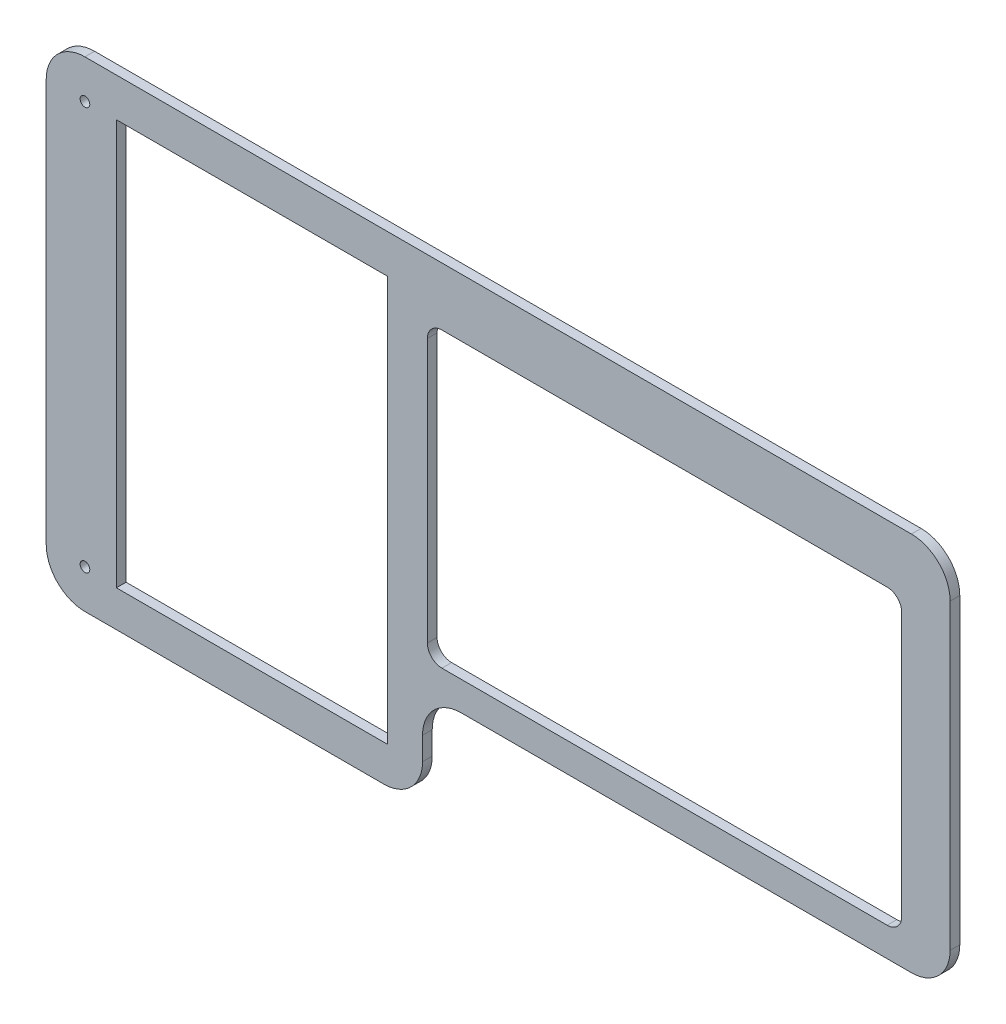
ISO-10303-21;
HEADER;
FILE_DESCRIPTION(('STEP AP214'),'2;1');
FILE_NAME('part.step','',(''),(''),'','','');
FILE_SCHEMA(('AUTOMOTIVE_DESIGN { 1 0 10303 214 1 1 1 1 }'));
ENDSEC;
DATA;
#1=APPLICATION_CONTEXT('core data for automotive mechanical design processes');
#2=APPLICATION_PROTOCOL_DEFINITION('international standard','automotive_design',2000,#1);
#3=PRODUCT_CONTEXT('',#1,'mechanical');
#4=PRODUCT('Part','Part','',(#3));
#5=PRODUCT_RELATED_PRODUCT_CATEGORY('part','',(#4));
#6=PRODUCT_DEFINITION_FORMATION('','',#4);
#7=PRODUCT_DEFINITION_CONTEXT('part definition',#1,'design');
#8=PRODUCT_DEFINITION('design','',#6,#7);
#9=PRODUCT_DEFINITION_SHAPE('','',#8);
#10=(LENGTH_UNIT() NAMED_UNIT(*) SI_UNIT(.MILLI.,.METRE.));
#11=(NAMED_UNIT(*) PLANE_ANGLE_UNIT() SI_UNIT($,.RADIAN.));
#12=(NAMED_UNIT(*) SI_UNIT($,.STERADIAN.) SOLID_ANGLE_UNIT());
#13=UNCERTAINTY_MEASURE_WITH_UNIT(LENGTH_MEASURE(1.E-05),#10,'distance_accuracy_value','');
#14=(GEOMETRIC_REPRESENTATION_CONTEXT(3) GLOBAL_UNCERTAINTY_ASSIGNED_CONTEXT((#13)) GLOBAL_UNIT_ASSIGNED_CONTEXT((#10,
#11,#12)) REPRESENTATION_CONTEXT('',''));
#15=CARTESIAN_POINT('',(0.,0.,0.));
#16=DIRECTION('',(0.,0.,1.));
#17=DIRECTION('',(1.,0.,0.));
#18=AXIS2_PLACEMENT_3D('',#15,#16,#17);
#19=CARTESIAN_POINT('',(51.,-31.,2.));
#20=DIRECTION('',(0.,0.,-1.));
#21=DIRECTION('',(-1.,0.,0.));
#22=AXIS2_PLACEMENT_3D('',#19,#20,#21);
#23=CYLINDRICAL_SURFACE('',#22,8.);
#24=CARTESIAN_POINT('',(51.,-31.,0.));
#25=DIRECTION('',(0.,0.,1.));
#26=DIRECTION('',(1.,0.,0.));
#27=AXIS2_PLACEMENT_3D('',#24,#25,#26);
#28=CIRCLE('',#27,8.);
#29=CARTESIAN_POINT('',(51.,-39.,0.));
#30=VERTEX_POINT('',#29);
#31=CARTESIAN_POINT('',(59.,-30.9999999999999,0.));
#32=VERTEX_POINT('',#31);
#33=EDGE_CURVE('E314',#30,#32,#28,.T.);
#34=ORIENTED_EDGE('',*,*,#33,.T.);
#35=DIRECTION('',(0.,0.,-1.));
#36=VECTOR('',#35,1.);
#37=CARTESIAN_POINT('',(59.,-30.9999999999999,2.));
#38=LINE('',#37,#36);
#39=CARTESIAN_POINT('',(59.,-30.9999999999999,2.));
#40=VERTEX_POINT('',#39);
#41=EDGE_CURVE('E11',#40,#32,#38,.T.);
#42=ORIENTED_EDGE('',*,*,#41,.F.);
#43=CARTESIAN_POINT('',(51.,-31.,2.));
#44=DIRECTION('',(0.,0.,1.));
#45=DIRECTION('',(1.,0.,0.));
#46=AXIS2_PLACEMENT_3D('',#43,#44,#45);
#47=CIRCLE('',#46,8.);
#48=CARTESIAN_POINT('',(51.,-39.,2.));
#49=VERTEX_POINT('',#48);
#50=EDGE_CURVE('E315',#49,#40,#47,.T.);
#51=ORIENTED_EDGE('',*,*,#50,.F.);
#52=DIRECTION('',(0.,0.,-1.));
#53=VECTOR('',#52,1.);
#54=CARTESIAN_POINT('',(51.,-39.,2.));
#55=LINE('',#54,#53);
#56=EDGE_CURVE('E353',#49,#30,#55,.T.);
#57=ORIENTED_EDGE('',*,*,#56,.T.);
#58=EDGE_LOOP('',(#34,#42,#51,#57));
#59=FACE_BOUND('',#58,.T.);
#60=ADVANCED_FACE('F39',(#59),#23,.T.);
#61=CARTESIAN_POINT('',(59.,31.5,2.));
#62=DIRECTION('',(-1.,0.,0.));
#63=DIRECTION('',(0.,-1.,0.));
#64=AXIS2_PLACEMENT_3D('',#61,#62,#63);
#65=PLANE('',#64);
#66=DIRECTION('',(0.,1.,0.));
#67=VECTOR('',#66,1.);
#68=CARTESIAN_POINT('',(59.,31.5,0.));
#69=LINE('',#68,#67);
#70=CARTESIAN_POINT('',(59.,31.5,0.));
#71=VERTEX_POINT('',#70);
#72=EDGE_CURVE('E357',#32,#71,#69,.T.);
#73=ORIENTED_EDGE('',*,*,#72,.T.);
#74=DIRECTION('',(0.,0.,-1.));
#75=VECTOR('',#74,1.);
#76=CARTESIAN_POINT('',(59.,31.5,2.));
#77=LINE('',#76,#75);
#78=CARTESIAN_POINT('',(59.,31.5,2.));
#79=VERTEX_POINT('',#78);
#80=EDGE_CURVE('E49',#79,#71,#77,.T.);
#81=ORIENTED_EDGE('',*,*,#80,.F.);
#82=DIRECTION('',(0.,1.,0.));
#83=VECTOR('',#82,1.);
#84=CARTESIAN_POINT('',(59.,31.5,2.));
#85=LINE('',#84,#83);
#86=EDGE_CURVE('E319',#40,#79,#85,.T.);
#87=ORIENTED_EDGE('',*,*,#86,.F.);
#88=ORIENTED_EDGE('',*,*,#41,.T.);
#89=EDGE_LOOP('',(#73,#81,#87,#88));
#90=FACE_BOUND('',#89,.T.);
#91=ADVANCED_FACE('F517',(#90),#65,.F.);
#92=CARTESIAN_POINT('',(51.,31.5,2.));
#93=DIRECTION('',(0.,0.,-1.));
#94=DIRECTION('',(-1.,0.,0.));
#95=AXIS2_PLACEMENT_3D('',#92,#93,#94);
#96=CYLINDRICAL_SURFACE('',#95,7.99999999999999);
#97=CARTESIAN_POINT('',(51.,31.5,0.));
#98=DIRECTION('',(0.,0.,1.));
#99=DIRECTION('',(-1.,0.,0.));
#100=AXIS2_PLACEMENT_3D('',#97,#98,#99);
#101=CIRCLE('',#100,7.99999999999999);
#102=CARTESIAN_POINT('',(51.,39.5,0.));
#103=VERTEX_POINT('',#102);
#104=EDGE_CURVE('E360',#71,#103,#101,.T.);
#105=ORIENTED_EDGE('',*,*,#104,.T.);
#106=DIRECTION('',(0.,0.,-1.));
#107=VECTOR('',#106,1.);
#108=CARTESIAN_POINT('',(51.,39.5,2.));
#109=LINE('',#108,#107);
#110=CARTESIAN_POINT('',(51.,39.5,2.));
#111=VERTEX_POINT('',#110);
#112=EDGE_CURVE('E424',#111,#103,#109,.T.);
#113=ORIENTED_EDGE('',*,*,#112,.F.);
#114=CARTESIAN_POINT('',(51.,31.5,2.));
#115=DIRECTION('',(0.,0.,1.));
#116=DIRECTION('',(-1.,0.,0.));
#117=AXIS2_PLACEMENT_3D('',#114,#115,#116);
#118=CIRCLE('',#117,7.99999999999999);
#119=EDGE_CURVE('E323',#79,#111,#118,.T.);
#120=ORIENTED_EDGE('',*,*,#119,.F.);
#121=ORIENTED_EDGE('',*,*,#80,.T.);
#122=EDGE_LOOP('',(#105,#113,#120,#121));
#123=FACE_BOUND('',#122,.T.);
#124=ADVANCED_FACE('F522',(#123),#96,.T.);
#125=CARTESIAN_POINT('',(-119.75,39.5,2.));
#126=DIRECTION('',(0.,-1.,0.));
#127=DIRECTION('',(1.,0.,0.));
#128=AXIS2_PLACEMENT_3D('',#125,#126,#127);
#129=PLANE('',#128);
#130=DIRECTION('',(-1.,0.,0.));
#131=VECTOR('',#130,1.);
#132=CARTESIAN_POINT('',(-119.75,39.5,0.));
#133=LINE('',#132,#131);
#134=CARTESIAN_POINT('',(-119.75,39.5,0.));
#135=VERTEX_POINT('',#134);
#136=EDGE_CURVE('E363',#103,#135,#133,.T.);
#137=ORIENTED_EDGE('',*,*,#136,.T.);
#138=DIRECTION('',(0.,0.,-1.));
#139=VECTOR('',#138,1.);
#140=CARTESIAN_POINT('',(-119.75,39.5,2.));
#141=LINE('',#140,#139);
#142=CARTESIAN_POINT('',(-119.75,39.5,2.));
#143=VERTEX_POINT('',#142);
#144=EDGE_CURVE('E420',#143,#135,#141,.T.);
#145=ORIENTED_EDGE('',*,*,#144,.F.);
#146=DIRECTION('',(-1.,0.,0.));
#147=VECTOR('',#146,1.);
#148=CARTESIAN_POINT('',(-119.75,39.5,2.));
#149=LINE('',#148,#147);
#150=EDGE_CURVE('E326',#111,#143,#149,.T.);
#151=ORIENTED_EDGE('',*,*,#150,.F.);
#152=ORIENTED_EDGE('',*,*,#112,.T.);
#153=EDGE_LOOP('',(#137,#145,#151,#152));
#154=FACE_BOUND('',#153,.T.);
#155=ADVANCED_FACE('F575',(#154),#129,.F.);
#156=CARTESIAN_POINT('',(-119.75,31.5,2.));
#157=DIRECTION('',(0.,0.,-1.));
#158=DIRECTION('',(-1.,0.,0.));
#159=AXIS2_PLACEMENT_3D('',#156,#157,#158);
#160=CYLINDRICAL_SURFACE('',#159,8.);
#161=CARTESIAN_POINT('',(-119.75,31.5,0.));
#162=DIRECTION('',(0.,0.,1.));
#163=DIRECTION('',(1.,0.,0.));
#164=AXIS2_PLACEMENT_3D('',#161,#162,#163);
#165=CIRCLE('',#164,8.);
#166=CARTESIAN_POINT('',(-127.75,31.5,0.));
#167=VERTEX_POINT('',#166);
#168=EDGE_CURVE('E366',#135,#167,#165,.T.);
#169=ORIENTED_EDGE('',*,*,#168,.T.);
#170=DIRECTION('',(0.,0.,-1.));
#171=VECTOR('',#170,1.);
#172=CARTESIAN_POINT('',(-127.75,31.5,2.));
#173=LINE('',#172,#171);
#174=CARTESIAN_POINT('',(-127.75,31.5,2.));
#175=VERTEX_POINT('',#174);
#176=EDGE_CURVE('E416',#175,#167,#173,.T.);
#177=ORIENTED_EDGE('',*,*,#176,.F.);
#178=CARTESIAN_POINT('',(-119.75,31.5,2.));
#179=DIRECTION('',(0.,0.,1.));
#180=DIRECTION('',(1.,0.,0.));
#181=AXIS2_PLACEMENT_3D('',#178,#179,#180);
#182=CIRCLE('',#181,8.);
#183=EDGE_CURVE('E329',#143,#175,#182,.T.);
#184=ORIENTED_EDGE('',*,*,#183,.F.);
#185=ORIENTED_EDGE('',*,*,#144,.T.);
#186=EDGE_LOOP('',(#169,#177,#184,#185));
#187=FACE_BOUND('',#186,.T.);
#188=ADVANCED_FACE('F572',(#187),#160,.T.);
#189=CARTESIAN_POINT('',(-127.75,31.5,2.));
#190=DIRECTION('',(1.,0.,0.));
#191=DIRECTION('',(0.,0.,-1.));
#192=AXIS2_PLACEMENT_3D('',#189,#190,#191);
#193=PLANE('',#192);
#194=DIRECTION('',(0.,-1.,0.));
#195=VECTOR('',#194,1.);
#196=CARTESIAN_POINT('',(-127.75,31.5,0.));
#197=LINE('',#196,#195);
#198=CARTESIAN_POINT('',(-127.75,-51.75,0.));
#199=VERTEX_POINT('',#198);
#200=EDGE_CURVE('E369',#167,#199,#197,.T.);
#201=ORIENTED_EDGE('',*,*,#200,.T.);
#202=DIRECTION('',(0.,0.,-1.));
#203=VECTOR('',#202,1.);
#204=CARTESIAN_POINT('',(-127.75,-51.75,2.));
#205=LINE('',#204,#203);
#206=CARTESIAN_POINT('',(-127.75,-51.75,2.));
#207=VERTEX_POINT('',#206);
#208=EDGE_CURVE('E412',#207,#199,#205,.T.);
#209=ORIENTED_EDGE('',*,*,#208,.F.);
#210=DIRECTION('',(0.,-1.,0.));
#211=VECTOR('',#210,1.);
#212=CARTESIAN_POINT('',(-127.75,31.5,2.));
#213=LINE('',#212,#211);
#214=EDGE_CURVE('E332',#175,#207,#213,.T.);
#215=ORIENTED_EDGE('',*,*,#214,.F.);
#216=ORIENTED_EDGE('',*,*,#176,.T.);
#217=EDGE_LOOP('',(#201,#209,#215,#216));
#218=FACE_BOUND('',#217,.T.);
#219=ADVANCED_FACE('F568',(#218),#193,.F.);
#220=CARTESIAN_POINT('',(-119.75,-51.75,2.));
#221=DIRECTION('',(0.,0.,-1.));
#222=DIRECTION('',(-1.,0.,0.));
#223=AXIS2_PLACEMENT_3D('',#220,#221,#222);
#224=CYLINDRICAL_SURFACE('',#223,8.00000000000001);
#225=CARTESIAN_POINT('',(-119.75,-51.75,0.));
#226=DIRECTION('',(0.,0.,1.));
#227=DIRECTION('',(1.,0.,0.));
#228=AXIS2_PLACEMENT_3D('',#225,#226,#227);
#229=CIRCLE('',#228,8.00000000000001);
#230=CARTESIAN_POINT('',(-119.75,-59.75,0.));
#231=VERTEX_POINT('',#230);
#232=EDGE_CURVE('E372',#199,#231,#229,.T.);
#233=ORIENTED_EDGE('',*,*,#232,.T.);
#234=DIRECTION('',(0.,0.,-1.));
#235=VECTOR('',#234,1.);
#236=CARTESIAN_POINT('',(-119.75,-59.75,2.));
#237=LINE('',#236,#235);
#238=CARTESIAN_POINT('',(-119.75,-59.75,2.));
#239=VERTEX_POINT('',#238);
#240=EDGE_CURVE('E408',#239,#231,#237,.T.);
#241=ORIENTED_EDGE('',*,*,#240,.F.);
#242=CARTESIAN_POINT('',(-119.75,-51.75,2.));
#243=DIRECTION('',(0.,0.,1.));
#244=DIRECTION('',(1.,0.,0.));
#245=AXIS2_PLACEMENT_3D('',#242,#243,#244);
#246=CIRCLE('',#245,8.00000000000001);
#247=EDGE_CURVE('E335',#207,#239,#246,.T.);
#248=ORIENTED_EDGE('',*,*,#247,.F.);
#249=ORIENTED_EDGE('',*,*,#208,.T.);
#250=EDGE_LOOP('',(#233,#241,#248,#249));
#251=FACE_BOUND('',#250,.T.);
#252=ADVANCED_FACE('F563',(#251),#224,.T.);
#253=CARTESIAN_POINT('',(-119.75,-59.75,2.));
#254=DIRECTION('',(0.,1.,0.));
#255=DIRECTION('',(0.,0.,1.));
#256=AXIS2_PLACEMENT_3D('',#253,#254,#255);
#257=PLANE('',#256);
#258=DIRECTION('',(1.,0.,0.));
#259=VECTOR('',#258,1.);
#260=CARTESIAN_POINT('',(-119.75,-59.75,0.));
#261=LINE('',#260,#259);
#262=CARTESIAN_POINT('',(-58.,-59.75,0.));
#263=VERTEX_POINT('',#262);
#264=EDGE_CURVE('E375',#231,#263,#261,.T.);
#265=ORIENTED_EDGE('',*,*,#264,.T.);
#266=DIRECTION('',(0.,0.,-1.));
#267=VECTOR('',#266,1.);
#268=CARTESIAN_POINT('',(-58.,-59.75,2.));
#269=LINE('',#268,#267);
#270=CARTESIAN_POINT('',(-58.,-59.75,2.));
#271=VERTEX_POINT('',#270);
#272=EDGE_CURVE('E404',#271,#263,#269,.T.);
#273=ORIENTED_EDGE('',*,*,#272,.F.);
#274=DIRECTION('',(1.,0.,0.));
#275=VECTOR('',#274,1.);
#276=CARTESIAN_POINT('',(-119.75,-59.75,2.));
#277=LINE('',#276,#275);
#278=EDGE_CURVE('E338',#239,#271,#277,.T.);
#279=ORIENTED_EDGE('',*,*,#278,.F.);
#280=ORIENTED_EDGE('',*,*,#240,.T.);
#281=EDGE_LOOP('',(#265,#273,#279,#280));
#282=FACE_BOUND('',#281,.T.);
#283=ADVANCED_FACE('F557',(#282),#257,.F.);
#284=CARTESIAN_POINT('',(-58.,-51.75,2.));
#285=DIRECTION('',(0.,0.,-1.));
#286=DIRECTION('',(-1.,0.,0.));
#287=AXIS2_PLACEMENT_3D('',#284,#285,#286);
#288=CYLINDRICAL_SURFACE('',#287,8.);
#289=CARTESIAN_POINT('',(-58.,-51.75,0.));
#290=DIRECTION('',(0.,0.,1.));
#291=DIRECTION('',(-1.,0.,0.));
#292=AXIS2_PLACEMENT_3D('',#289,#290,#291);
#293=CIRCLE('',#292,8.);
#294=CARTESIAN_POINT('',(-50.,-51.75,0.));
#295=VERTEX_POINT('',#294);
#296=EDGE_CURVE('E378',#263,#295,#293,.T.);
#297=ORIENTED_EDGE('',*,*,#296,.T.);
#298=DIRECTION('',(0.,0.,-1.));
#299=VECTOR('',#298,1.);
#300=CARTESIAN_POINT('',(-50.,-51.75,2.));
#301=LINE('',#300,#299);
#302=CARTESIAN_POINT('',(-50.,-51.75,2.));
#303=VERTEX_POINT('',#302);
#304=EDGE_CURVE('E400',#303,#295,#301,.T.);
#305=ORIENTED_EDGE('',*,*,#304,.F.);
#306=CARTESIAN_POINT('',(-58.,-51.75,2.));
#307=DIRECTION('',(0.,0.,1.));
#308=DIRECTION('',(-1.,0.,0.));
#309=AXIS2_PLACEMENT_3D('',#306,#307,#308);
#310=CIRCLE('',#309,8.);
#311=EDGE_CURVE('E341',#271,#303,#310,.T.);
#312=ORIENTED_EDGE('',*,*,#311,.F.);
#313=ORIENTED_EDGE('',*,*,#272,.T.);
#314=EDGE_LOOP('',(#297,#305,#312,#313));
#315=FACE_BOUND('',#314,.T.);
#316=ADVANCED_FACE('F553',(#315),#288,.T.);
#317=CARTESIAN_POINT('',(-50.,-51.75,2.));
#318=DIRECTION('',(-1.,0.,0.));
#319=DIRECTION('',(0.,0.,1.));
#320=AXIS2_PLACEMENT_3D('',#317,#318,#319);
#321=PLANE('',#320);
#322=DIRECTION('',(0.,1.,0.));
#323=VECTOR('',#322,1.);
#324=CARTESIAN_POINT('',(-50.,-51.75,0.));
#325=LINE('',#324,#323);
#326=CARTESIAN_POINT('',(-50.,-47.0000000000001,0.));
#327=VERTEX_POINT('',#326);
#328=EDGE_CURVE('E381',#295,#327,#325,.T.);
#329=ORIENTED_EDGE('',*,*,#328,.T.);
#330=DIRECTION('',(0.,0.,-1.));
#331=VECTOR('',#330,1.);
#332=CARTESIAN_POINT('',(-50.,-47.0000000000001,2.));
#333=LINE('',#332,#331);
#334=CARTESIAN_POINT('',(-50.,-47.0000000000001,2.));
#335=VERTEX_POINT('',#334);
#336=EDGE_CURVE('E396',#335,#327,#333,.T.);
#337=ORIENTED_EDGE('',*,*,#336,.F.);
#338=DIRECTION('',(0.,1.,0.));
#339=VECTOR('',#338,1.);
#340=CARTESIAN_POINT('',(-50.,-51.75,2.));
#341=LINE('',#340,#339);
#342=EDGE_CURVE('E344',#303,#335,#341,.T.);
#343=ORIENTED_EDGE('',*,*,#342,.F.);
#344=ORIENTED_EDGE('',*,*,#304,.T.);
#345=EDGE_LOOP('',(#329,#337,#343,#344));
#346=FACE_BOUND('',#345,.T.);
#347=ADVANCED_FACE('F548',(#346),#321,.F.);
#348=CARTESIAN_POINT('',(-42.,-47.,2.));
#349=DIRECTION('',(0.,0.,-1.));
#350=DIRECTION('',(-1.,0.,0.));
#351=AXIS2_PLACEMENT_3D('',#348,#349,#350);
#352=CYLINDRICAL_SURFACE('',#351,8.);
#353=CARTESIAN_POINT('',(-42.,-47.,0.));
#354=DIRECTION('',(0.,0.,-1.));
#355=DIRECTION('',(-1.,0.,0.));
#356=AXIS2_PLACEMENT_3D('',#353,#354,#355);
#357=CIRCLE('',#356,8.);
#358=CARTESIAN_POINT('',(-41.9999999999999,-39.,0.));
#359=VERTEX_POINT('',#358);
#360=EDGE_CURVE('E384',#327,#359,#357,.T.);
#361=ORIENTED_EDGE('',*,*,#360,.T.);
#362=DIRECTION('',(0.,0.,-1.));
#363=VECTOR('',#362,1.);
#364=CARTESIAN_POINT('',(-41.9999999999999,-39.,2.));
#365=LINE('',#364,#363);
#366=CARTESIAN_POINT('',(-41.9999999999999,-39.,2.));
#367=VERTEX_POINT('',#366);
#368=EDGE_CURVE('E392',#367,#359,#365,.T.);
#369=ORIENTED_EDGE('',*,*,#368,.F.);
#370=CARTESIAN_POINT('',(-42.,-47.,2.));
#371=DIRECTION('',(0.,0.,-1.));
#372=DIRECTION('',(-1.,0.,0.));
#373=AXIS2_PLACEMENT_3D('',#370,#371,#372);
#374=CIRCLE('',#373,8.);
#375=EDGE_CURVE('E347',#335,#367,#374,.T.);
#376=ORIENTED_EDGE('',*,*,#375,.F.);
#377=ORIENTED_EDGE('',*,*,#336,.T.);
#378=EDGE_LOOP('',(#361,#369,#376,#377));
#379=FACE_BOUND('',#378,.T.);
#380=ADVANCED_FACE('F542',(#379),#352,.F.);
#381=CARTESIAN_POINT('',(-41.9999999999999,-39.,2.));
#382=DIRECTION('',(0.,1.,0.));
#383=DIRECTION('',(0.,0.,1.));
#384=AXIS2_PLACEMENT_3D('',#381,#382,#383);
#385=PLANE('',#384);
#386=DIRECTION('',(1.,0.,0.));
#387=VECTOR('',#386,1.);
#388=CARTESIAN_POINT('',(-41.9999999999999,-39.,0.));
#389=LINE('',#388,#387);
#390=EDGE_CURVE('E320',#359,#30,#389,.T.);
#391=ORIENTED_EDGE('',*,*,#390,.T.);
#392=ORIENTED_EDGE('',*,*,#56,.F.);
#393=DIRECTION('',(1.,0.,0.));
#394=VECTOR('',#393,1.);
#395=CARTESIAN_POINT('',(-41.9999999999999,-39.,2.));
#396=LINE('',#395,#394);
#397=EDGE_CURVE('E350',#367,#49,#396,.T.);
#398=ORIENTED_EDGE('',*,*,#397,.F.);
#399=ORIENTED_EDGE('',*,*,#368,.T.);
#400=EDGE_LOOP('',(#391,#392,#398,#399));
#401=FACE_BOUND('',#400,.T.);
#402=ADVANCED_FACE('F540',(#401),#385,.F.);
#403=CARTESIAN_POINT('',(51.,-31.,2.));
#404=DIRECTION('',(0.,0.,1.));
#405=DIRECTION('',(1.,0.,0.));
#406=AXIS2_PLACEMENT_3D('',#403,#404,#405);
#407=PLANE('',#406);
#408=DIRECTION('',(0.,-1.,0.));
#409=VECTOR('',#408,1.);
#410=CARTESIAN_POINT('',(-113.25,-31.,2.));
#411=LINE('',#410,#409);
#412=CARTESIAN_POINT('',(-113.25,31.5,2.));
#413=VERTEX_POINT('',#412);
#414=CARTESIAN_POINT('',(-113.25,-52.25,2.));
#415=VERTEX_POINT('',#414);
#416=EDGE_CURVE('E295',#413,#415,#411,.T.);
#417=ORIENTED_EDGE('',*,*,#416,.F.);
#418=DIRECTION('',(-1.,0.,0.));
#419=VECTOR('',#418,1.);
#420=CARTESIAN_POINT('',(51.,31.5,2.));
#421=LINE('',#420,#419);
#422=CARTESIAN_POINT('',(-57.25,31.5,2.));
#423=VERTEX_POINT('',#422);
#424=EDGE_CURVE('E292',#423,#413,#421,.T.);
#425=ORIENTED_EDGE('',*,*,#424,.F.);
#426=DIRECTION('',(0.,1.,0.));
#427=VECTOR('',#426,1.);
#428=CARTESIAN_POINT('',(-57.25,-31.,2.));
#429=LINE('',#428,#427);
#430=CARTESIAN_POINT('',(-57.25,-52.25,2.));
#431=VERTEX_POINT('',#430);
#432=EDGE_CURVE('E289',#431,#423,#429,.T.);
#433=ORIENTED_EDGE('',*,*,#432,.F.);
#434=DIRECTION('',(1.,0.,0.));
#435=VECTOR('',#434,1.);
#436=CARTESIAN_POINT('',(51.,-52.25,2.));
#437=LINE('',#436,#435);
#438=EDGE_CURVE('E95',#415,#431,#437,.T.);
#439=ORIENTED_EDGE('',*,*,#438,.F.);
#440=EDGE_LOOP('',(#417,#425,#433,#439));
#441=FACE_BOUND('',#440,.T.);
#442=CARTESIAN_POINT('',(46.,24.5,2.));
#443=DIRECTION('',(0.,0.,1.));
#444=DIRECTION('',(1.,0.,0.));
#445=AXIS2_PLACEMENT_3D('',#442,#443,#444);
#446=CIRCLE('',#445,3.);
#447=CARTESIAN_POINT('',(49.,24.5,2.));
#448=VERTEX_POINT('',#447);
#449=CARTESIAN_POINT('',(46.,27.5,2.));
#450=VERTEX_POINT('',#449);
#451=EDGE_CURVE('E42',#448,#450,#446,.T.);
#452=ORIENTED_EDGE('',*,*,#451,.F.);
#453=DIRECTION('',(0.,1.,0.));
#454=VECTOR('',#453,1.);
#455=CARTESIAN_POINT('',(49.,24.5,2.));
#456=LINE('',#455,#454);
#457=CARTESIAN_POINT('',(49.,-30.,2.));
#458=VERTEX_POINT('',#457);
#459=EDGE_CURVE('E89',#458,#448,#456,.T.);
#460=ORIENTED_EDGE('',*,*,#459,.F.);
#461=CARTESIAN_POINT('',(46.,-30.,2.));
#462=DIRECTION('',(0.,0.,1.));
#463=DIRECTION('',(1.,0.,0.));
#464=AXIS2_PLACEMENT_3D('',#461,#462,#463);
#465=CIRCLE('',#464,3.);
#466=CARTESIAN_POINT('',(46.,-33.,2.));
#467=VERTEX_POINT('',#466);
#468=EDGE_CURVE('E445',#467,#458,#465,.T.);
#469=ORIENTED_EDGE('',*,*,#468,.F.);
#470=DIRECTION('',(1.,0.,0.));
#471=VECTOR('',#470,1.);
#472=CARTESIAN_POINT('',(-46.,-33.,2.));
#473=LINE('',#472,#471);
#474=CARTESIAN_POINT('',(-46.,-33.,2.));
#475=VERTEX_POINT('',#474);
#476=EDGE_CURVE('E442',#475,#467,#473,.T.);
#477=ORIENTED_EDGE('',*,*,#476,.F.);
#478=CARTESIAN_POINT('',(-46.,-30.,2.));
#479=DIRECTION('',(0.,0.,1.));
#480=DIRECTION('',(1.,0.,0.));
#481=AXIS2_PLACEMENT_3D('',#478,#479,#480);
#482=CIRCLE('',#481,3.);
#483=CARTESIAN_POINT('',(-49.,-30.,2.));
#484=VERTEX_POINT('',#483);
#485=EDGE_CURVE('E439',#484,#475,#482,.T.);
#486=ORIENTED_EDGE('',*,*,#485,.F.);
#487=DIRECTION('',(0.,1.,0.));
#488=VECTOR('',#487,1.);
#489=CARTESIAN_POINT('',(-49.,24.5,2.));
#490=LINE('',#489,#488);
#491=CARTESIAN_POINT('',(-49.,24.5,2.));
#492=VERTEX_POINT('',#491);
#493=EDGE_CURVE('E436',#492,#484,#490,.F.);
#494=ORIENTED_EDGE('',*,*,#493,.F.);
#495=CARTESIAN_POINT('',(-46.,24.5,2.));
#496=DIRECTION('',(0.,0.,1.));
#497=DIRECTION('',(1.,0.,0.));
#498=AXIS2_PLACEMENT_3D('',#495,#496,#497);
#499=CIRCLE('',#498,3.);
#500=CARTESIAN_POINT('',(-46.,27.5,2.));
#501=VERTEX_POINT('',#500);
#502=EDGE_CURVE('E433',#501,#492,#499,.T.);
#503=ORIENTED_EDGE('',*,*,#502,.F.);
#504=DIRECTION('',(1.,0.,0.));
#505=VECTOR('',#504,1.);
#506=CARTESIAN_POINT('',(-46.,27.5,2.));
#507=LINE('',#506,#505);
#508=EDGE_CURVE('E225',#450,#501,#507,.F.);
#509=ORIENTED_EDGE('',*,*,#508,.F.);
#510=EDGE_LOOP('',(#452,#460,#469,#477,#486,#494,#503,#509));
#511=FACE_BOUND('',#510,.T.);
#512=CARTESIAN_POINT('',(-119.75,31.5,2.));
#513=DIRECTION('',(0.,0.,1.));
#514=DIRECTION('',(1.,0.,0.));
#515=AXIS2_PLACEMENT_3D('',#512,#513,#514);
#516=CIRCLE('',#515,0.999999999999998);
#517=CARTESIAN_POINT('',(-118.75,31.5,2.));
#518=VERTEX_POINT('',#517);
#519=EDGE_CURVE('E310',#518,#518,#516,.T.);
#520=ORIENTED_EDGE('',*,*,#519,.F.);
#521=EDGE_LOOP('',(#520));
#522=FACE_BOUND('',#521,.T.);
#523=CARTESIAN_POINT('',(-119.75,-51.75,2.));
#524=DIRECTION('',(0.,0.,1.));
#525=DIRECTION('',(1.,0.,0.));
#526=AXIS2_PLACEMENT_3D('',#523,#524,#525);
#527=CIRCLE('',#526,0.999999999999998);
#528=CARTESIAN_POINT('',(-118.75,-51.75,2.));
#529=VERTEX_POINT('',#528);
#530=EDGE_CURVE('E303',#529,#529,#527,.T.);
#531=ORIENTED_EDGE('',*,*,#530,.F.);
#532=EDGE_LOOP('',(#531));
#533=FACE_BOUND('',#532,.T.);
#534=ORIENTED_EDGE('',*,*,#50,.T.);
#535=ORIENTED_EDGE('',*,*,#86,.T.);
#536=ORIENTED_EDGE('',*,*,#119,.T.);
#537=ORIENTED_EDGE('',*,*,#150,.T.);
#538=ORIENTED_EDGE('',*,*,#183,.T.);
#539=ORIENTED_EDGE('',*,*,#214,.T.);
#540=ORIENTED_EDGE('',*,*,#247,.T.);
#541=ORIENTED_EDGE('',*,*,#278,.T.);
#542=ORIENTED_EDGE('',*,*,#311,.T.);
#543=ORIENTED_EDGE('',*,*,#342,.T.);
#544=ORIENTED_EDGE('',*,*,#375,.T.);
#545=ORIENTED_EDGE('',*,*,#397,.T.);
#546=EDGE_LOOP('',(#534,#535,#536,#537,#538,#539,#540,#541,#542,#543,#544,#545));
#547=FACE_BOUND('',#546,.T.);
#548=ADVANCED_FACE('F460',(#441,#511,#522,#533,#547),#407,.T.);
#549=CARTESIAN_POINT('',(51.,-31.,0.));
#550=DIRECTION('',(0.,0.,1.));
#551=DIRECTION('',(1.,0.,0.));
#552=AXIS2_PLACEMENT_3D('',#549,#550,#551);
#553=PLANE('',#552);
#554=DIRECTION('',(-1.,0.,0.));
#555=VECTOR('',#554,1.);
#556=CARTESIAN_POINT('',(-113.25,31.5,0.));
#557=LINE('',#556,#555);
#558=CARTESIAN_POINT('',(-57.25,31.5,0.));
#559=VERTEX_POINT('',#558);
#560=CARTESIAN_POINT('',(-113.25,31.5,0.));
#561=VERTEX_POINT('',#560);
#562=EDGE_CURVE('E201',#559,#561,#557,.T.);
#563=ORIENTED_EDGE('',*,*,#562,.T.);
#564=DIRECTION('',(0.,-1.,0.));
#565=VECTOR('',#564,1.);
#566=CARTESIAN_POINT('',(-113.25,31.5,0.));
#567=LINE('',#566,#565);
#568=CARTESIAN_POINT('',(-113.25,-52.25,0.));
#569=VERTEX_POINT('',#568);
#570=EDGE_CURVE('E212',#561,#569,#567,.T.);
#571=ORIENTED_EDGE('',*,*,#570,.T.);
#572=DIRECTION('',(1.,0.,0.));
#573=VECTOR('',#572,1.);
#574=CARTESIAN_POINT('',(-113.25,-52.25,0.));
#575=LINE('',#574,#573);
#576=CARTESIAN_POINT('',(-57.25,-52.25,0.));
#577=VERTEX_POINT('',#576);
#578=EDGE_CURVE('E202',#569,#577,#575,.T.);
#579=ORIENTED_EDGE('',*,*,#578,.T.);
#580=DIRECTION('',(0.,1.,0.));
#581=VECTOR('',#580,1.);
#582=CARTESIAN_POINT('',(-57.25,31.5,0.));
#583=LINE('',#582,#581);
#584=EDGE_CURVE('E189',#577,#559,#583,.T.);
#585=ORIENTED_EDGE('',*,*,#584,.T.);
#586=EDGE_LOOP('',(#563,#571,#579,#585));
#587=FACE_BOUND('',#586,.T.);
#588=DIRECTION('',(0.,1.,0.));
#589=VECTOR('',#588,1.);
#590=CARTESIAN_POINT('',(49.,24.5,0.));
#591=LINE('',#590,#589);
#592=CARTESIAN_POINT('',(49.,-30.,0.));
#593=VERTEX_POINT('',#592);
#594=CARTESIAN_POINT('',(49.,24.5,0.));
#595=VERTEX_POINT('',#594);
#596=EDGE_CURVE('E256',#593,#595,#591,.T.);
#597=ORIENTED_EDGE('',*,*,#596,.T.);
#598=CARTESIAN_POINT('',(46.,24.5,0.));
#599=DIRECTION('',(0.,0.,1.));
#600=DIRECTION('',(-1.,0.,0.));
#601=AXIS2_PLACEMENT_3D('',#598,#599,#600);
#602=CIRCLE('',#601,3.);
#603=CARTESIAN_POINT('',(46.,27.5,0.));
#604=VERTEX_POINT('',#603);
#605=EDGE_CURVE('E230',#595,#604,#602,.T.);
#606=ORIENTED_EDGE('',*,*,#605,.T.);
#607=DIRECTION('',(-1.,0.,0.));
#608=VECTOR('',#607,1.);
#609=CARTESIAN_POINT('',(-46.,27.5,0.));
#610=LINE('',#609,#608);
#611=CARTESIAN_POINT('',(-46.,27.5,0.));
#612=VERTEX_POINT('',#611);
#613=EDGE_CURVE('E234',#604,#612,#610,.T.);
#614=ORIENTED_EDGE('',*,*,#613,.T.);
#615=CARTESIAN_POINT('',(-46.,24.5,0.));
#616=DIRECTION('',(0.,0.,1.));
#617=DIRECTION('',(1.,0.,0.));
#618=AXIS2_PLACEMENT_3D('',#615,#616,#617);
#619=CIRCLE('',#618,3.);
#620=CARTESIAN_POINT('',(-49.,24.5,0.));
#621=VERTEX_POINT('',#620);
#622=EDGE_CURVE('E183',#612,#621,#619,.T.);
#623=ORIENTED_EDGE('',*,*,#622,.T.);
#624=DIRECTION('',(0.,-1.,0.));
#625=VECTOR('',#624,1.);
#626=CARTESIAN_POINT('',(-49.,24.5,0.));
#627=LINE('',#626,#625);
#628=CARTESIAN_POINT('',(-49.,-30.,0.));
#629=VERTEX_POINT('',#628);
#630=EDGE_CURVE('E240',#621,#629,#627,.T.);
#631=ORIENTED_EDGE('',*,*,#630,.T.);
#632=CARTESIAN_POINT('',(-46.,-30.,0.));
#633=DIRECTION('',(0.,0.,1.));
#634=DIRECTION('',(1.,0.,0.));
#635=AXIS2_PLACEMENT_3D('',#632,#633,#634);
#636=CIRCLE('',#635,3.);
#637=CARTESIAN_POINT('',(-46.,-33.,0.));
#638=VERTEX_POINT('',#637);
#639=EDGE_CURVE('E244',#629,#638,#636,.T.);
#640=ORIENTED_EDGE('',*,*,#639,.T.);
#641=DIRECTION('',(1.,0.,0.));
#642=VECTOR('',#641,1.);
#643=CARTESIAN_POINT('',(-46.,-33.,0.));
#644=LINE('',#643,#642);
#645=CARTESIAN_POINT('',(46.,-33.,0.));
#646=VERTEX_POINT('',#645);
#647=EDGE_CURVE('E248',#638,#646,#644,.T.);
#648=ORIENTED_EDGE('',*,*,#647,.T.);
#649=CARTESIAN_POINT('',(46.,-30.,0.));
#650=DIRECTION('',(0.,0.,1.));
#651=DIRECTION('',(1.,0.,0.));
#652=AXIS2_PLACEMENT_3D('',#649,#650,#651);
#653=CIRCLE('',#652,3.);
#654=EDGE_CURVE('E252',#646,#593,#653,.T.);
#655=ORIENTED_EDGE('',*,*,#654,.T.);
#656=EDGE_LOOP('',(#597,#606,#614,#623,#631,#640,#648,#655));
#657=FACE_BOUND('',#656,.T.);
#658=CARTESIAN_POINT('',(-119.75,31.5,0.));
#659=DIRECTION('',(0.,0.,1.));
#660=DIRECTION('',(1.,0.,0.));
#661=AXIS2_PLACEMENT_3D('',#658,#659,#660);
#662=CIRCLE('',#661,0.999999999999998);
#663=CARTESIAN_POINT('',(-118.75,31.5,0.));
#664=VERTEX_POINT('',#663);
#665=EDGE_CURVE('E299',#664,#664,#662,.T.);
#666=ORIENTED_EDGE('',*,*,#665,.T.);
#667=EDGE_LOOP('',(#666));
#668=FACE_BOUND('',#667,.T.);
#669=CARTESIAN_POINT('',(-119.75,-51.75,0.));
#670=DIRECTION('',(0.,0.,1.));
#671=DIRECTION('',(1.,0.,0.));
#672=AXIS2_PLACEMENT_3D('',#669,#670,#671);
#673=CIRCLE('',#672,0.999999999999998);
#674=CARTESIAN_POINT('',(-118.75,-51.75,0.));
#675=VERTEX_POINT('',#674);
#676=EDGE_CURVE('E298',#675,#675,#673,.T.);
#677=ORIENTED_EDGE('',*,*,#676,.T.);
#678=EDGE_LOOP('',(#677));
#679=FACE_BOUND('',#678,.T.);
#680=ORIENTED_EDGE('',*,*,#33,.F.);
#681=ORIENTED_EDGE('',*,*,#390,.F.);
#682=ORIENTED_EDGE('',*,*,#360,.F.);
#683=ORIENTED_EDGE('',*,*,#328,.F.);
#684=ORIENTED_EDGE('',*,*,#296,.F.);
#685=ORIENTED_EDGE('',*,*,#264,.F.);
#686=ORIENTED_EDGE('',*,*,#232,.F.);
#687=ORIENTED_EDGE('',*,*,#200,.F.);
#688=ORIENTED_EDGE('',*,*,#168,.F.);
#689=ORIENTED_EDGE('',*,*,#136,.F.);
#690=ORIENTED_EDGE('',*,*,#104,.F.);
#691=ORIENTED_EDGE('',*,*,#72,.F.);
#692=EDGE_LOOP('',(#680,#681,#682,#683,#684,#685,#686,#687,#688,#689,#690,#691));
#693=FACE_BOUND('',#692,.T.);
#694=ADVANCED_FACE('F209',(#587,#657,#668,#679,#693),#553,.F.);
#695=CARTESIAN_POINT('',(-119.75,-51.75,0.));
#696=DIRECTION('',(0.,0.,1.));
#697=DIRECTION('',(1.,0.,0.));
#698=AXIS2_PLACEMENT_3D('',#695,#696,#697);
#699=CYLINDRICAL_SURFACE('',#698,0.999999999999998);
#700=ORIENTED_EDGE('',*,*,#530,.T.);
#701=EDGE_LOOP('',(#700));
#702=FACE_BOUND('',#701,.T.);
#703=ORIENTED_EDGE('',*,*,#676,.F.);
#704=EDGE_LOOP('',(#703));
#705=FACE_BOUND('',#704,.T.);
#706=ADVANCED_FACE('F604',(#702,#705),#699,.F.);
#707=CARTESIAN_POINT('',(-119.75,31.5,0.));
#708=DIRECTION('',(0.,0.,1.));
#709=DIRECTION('',(1.,0.,0.));
#710=AXIS2_PLACEMENT_3D('',#707,#708,#709);
#711=CYLINDRICAL_SURFACE('',#710,0.999999999999998);
#712=ORIENTED_EDGE('',*,*,#519,.T.);
#713=EDGE_LOOP('',(#712));
#714=FACE_BOUND('',#713,.T.);
#715=ORIENTED_EDGE('',*,*,#665,.F.);
#716=EDGE_LOOP('',(#715));
#717=FACE_BOUND('',#716,.T.);
#718=ADVANCED_FACE('F610',(#714,#717),#711,.F.);
#719=CARTESIAN_POINT('',(46.,24.5,0.));
#720=DIRECTION('',(0.,0.,1.));
#721=DIRECTION('',(1.,0.,0.));
#722=AXIS2_PLACEMENT_3D('',#719,#720,#721);
#723=CYLINDRICAL_SURFACE('',#722,3.);
#724=ORIENTED_EDGE('',*,*,#451,.T.);
#725=DIRECTION('',(0.,0.,1.));
#726=VECTOR('',#725,1.);
#727=CARTESIAN_POINT('',(46.,27.5,0.));
#728=LINE('',#727,#726);
#729=EDGE_CURVE('E260',#604,#450,#728,.T.);
#730=ORIENTED_EDGE('',*,*,#729,.F.);
#731=ORIENTED_EDGE('',*,*,#605,.F.);
#732=DIRECTION('',(0.,0.,1.));
#733=VECTOR('',#732,1.);
#734=CARTESIAN_POINT('',(49.,24.5,0.));
#735=LINE('',#734,#733);
#736=EDGE_CURVE('E216',#595,#448,#735,.T.);
#737=ORIENTED_EDGE('',*,*,#736,.T.);
#738=EDGE_LOOP('',(#724,#730,#731,#737));
#739=FACE_BOUND('',#738,.T.);
#740=ADVANCED_FACE('F454',(#739),#723,.F.);
#741=CARTESIAN_POINT('',(49.,24.5,0.));
#742=DIRECTION('',(1.,0.,0.));
#743=DIRECTION('',(0.,1.,0.));
#744=AXIS2_PLACEMENT_3D('',#741,#742,#743);
#745=PLANE('',#744);
#746=ORIENTED_EDGE('',*,*,#459,.T.);
#747=ORIENTED_EDGE('',*,*,#736,.F.);
#748=ORIENTED_EDGE('',*,*,#596,.F.);
#749=DIRECTION('',(0.,0.,1.));
#750=VECTOR('',#749,1.);
#751=CARTESIAN_POINT('',(49.,-30.,0.));
#752=LINE('',#751,#750);
#753=EDGE_CURVE('E261',#593,#458,#752,.T.);
#754=ORIENTED_EDGE('',*,*,#753,.T.);
#755=EDGE_LOOP('',(#746,#747,#748,#754));
#756=FACE_BOUND('',#755,.T.);
#757=ADVANCED_FACE('F616',(#756),#745,.F.);
#758=CARTESIAN_POINT('',(46.,-30.,0.));
#759=DIRECTION('',(0.,0.,1.));
#760=DIRECTION('',(1.,0.,0.));
#761=AXIS2_PLACEMENT_3D('',#758,#759,#760);
#762=CYLINDRICAL_SURFACE('',#761,3.);
#763=ORIENTED_EDGE('',*,*,#468,.T.);
#764=ORIENTED_EDGE('',*,*,#753,.F.);
#765=ORIENTED_EDGE('',*,*,#654,.F.);
#766=DIRECTION('',(0.,0.,1.));
#767=VECTOR('',#766,1.);
#768=CARTESIAN_POINT('',(46.,-33.,0.));
#769=LINE('',#768,#767);
#770=EDGE_CURVE('E264',#646,#467,#769,.T.);
#771=ORIENTED_EDGE('',*,*,#770,.T.);
#772=EDGE_LOOP('',(#763,#764,#765,#771));
#773=FACE_BOUND('',#772,.T.);
#774=ADVANCED_FACE('F626',(#773),#762,.F.);
#775=CARTESIAN_POINT('',(-46.,-33.,0.));
#776=DIRECTION('',(0.,-1.,0.));
#777=DIRECTION('',(0.,0.,-1.));
#778=AXIS2_PLACEMENT_3D('',#775,#776,#777);
#779=PLANE('',#778);
#780=ORIENTED_EDGE('',*,*,#476,.T.);
#781=ORIENTED_EDGE('',*,*,#770,.F.);
#782=ORIENTED_EDGE('',*,*,#647,.F.);
#783=DIRECTION('',(0.,0.,1.));
#784=VECTOR('',#783,1.);
#785=CARTESIAN_POINT('',(-46.,-33.,0.));
#786=LINE('',#785,#784);
#787=EDGE_CURVE('E273',#638,#475,#786,.T.);
#788=ORIENTED_EDGE('',*,*,#787,.T.);
#789=EDGE_LOOP('',(#780,#781,#782,#788));
#790=FACE_BOUND('',#789,.T.);
#791=ADVANCED_FACE('F481',(#790),#779,.F.);
#792=CARTESIAN_POINT('',(-46.,-30.,0.));
#793=DIRECTION('',(0.,0.,1.));
#794=DIRECTION('',(1.,0.,0.));
#795=AXIS2_PLACEMENT_3D('',#792,#793,#794);
#796=CYLINDRICAL_SURFACE('',#795,3.);
#797=ORIENTED_EDGE('',*,*,#485,.T.);
#798=ORIENTED_EDGE('',*,*,#787,.F.);
#799=ORIENTED_EDGE('',*,*,#639,.F.);
#800=DIRECTION('',(0.,0.,1.));
#801=VECTOR('',#800,1.);
#802=CARTESIAN_POINT('',(-49.,-30.,0.));
#803=LINE('',#802,#801);
#804=EDGE_CURVE('E277',#629,#484,#803,.T.);
#805=ORIENTED_EDGE('',*,*,#804,.T.);
#806=EDGE_LOOP('',(#797,#798,#799,#805));
#807=FACE_BOUND('',#806,.T.);
#808=ADVANCED_FACE('F476',(#807),#796,.F.);
#809=CARTESIAN_POINT('',(-49.,24.5,0.));
#810=DIRECTION('',(-1.,0.,0.));
#811=DIRECTION('',(0.,0.,1.));
#812=AXIS2_PLACEMENT_3D('',#809,#810,#811);
#813=PLANE('',#812);
#814=ORIENTED_EDGE('',*,*,#493,.T.);
#815=ORIENTED_EDGE('',*,*,#804,.F.);
#816=ORIENTED_EDGE('',*,*,#630,.F.);
#817=DIRECTION('',(0.,0.,1.));
#818=VECTOR('',#817,1.);
#819=CARTESIAN_POINT('',(-49.,24.5,0.));
#820=LINE('',#819,#818);
#821=EDGE_CURVE('E281',#621,#492,#820,.T.);
#822=ORIENTED_EDGE('',*,*,#821,.T.);
#823=EDGE_LOOP('',(#814,#815,#816,#822));
#824=FACE_BOUND('',#823,.T.);
#825=ADVANCED_FACE('F469',(#824),#813,.F.);
#826=CARTESIAN_POINT('',(-46.,24.5,0.));
#827=DIRECTION('',(0.,0.,1.));
#828=DIRECTION('',(1.,0.,0.));
#829=AXIS2_PLACEMENT_3D('',#826,#827,#828);
#830=CYLINDRICAL_SURFACE('',#829,3.);
#831=ORIENTED_EDGE('',*,*,#502,.T.);
#832=ORIENTED_EDGE('',*,*,#821,.F.);
#833=ORIENTED_EDGE('',*,*,#622,.F.);
#834=DIRECTION('',(0.,0.,1.));
#835=VECTOR('',#834,1.);
#836=CARTESIAN_POINT('',(-46.,27.5,0.));
#837=LINE('',#836,#835);
#838=EDGE_CURVE('E269',#612,#501,#837,.T.);
#839=ORIENTED_EDGE('',*,*,#838,.T.);
#840=EDGE_LOOP('',(#831,#832,#833,#839));
#841=FACE_BOUND('',#840,.T.);
#842=ADVANCED_FACE('F465',(#841),#830,.F.);
#843=CARTESIAN_POINT('',(-46.,27.5,0.));
#844=DIRECTION('',(0.,1.,0.));
#845=DIRECTION('',(0.,0.,1.));
#846=AXIS2_PLACEMENT_3D('',#843,#844,#845);
#847=PLANE('',#846);
#848=ORIENTED_EDGE('',*,*,#508,.T.);
#849=ORIENTED_EDGE('',*,*,#838,.F.);
#850=ORIENTED_EDGE('',*,*,#613,.F.);
#851=ORIENTED_EDGE('',*,*,#729,.T.);
#852=EDGE_LOOP('',(#848,#849,#850,#851));
#853=FACE_BOUND('',#852,.T.);
#854=ADVANCED_FACE('F464',(#853),#847,.F.);
#855=CARTESIAN_POINT('',(-113.25,31.5,0.));
#856=DIRECTION('',(-1.,0.,0.));
#857=DIRECTION('',(0.,-1.,0.));
#858=AXIS2_PLACEMENT_3D('',#855,#856,#857);
#859=PLANE('',#858);
#860=ORIENTED_EDGE('',*,*,#416,.T.);
#861=DIRECTION('',(0.,0.,1.));
#862=VECTOR('',#861,1.);
#863=CARTESIAN_POINT('',(-113.25,-52.25,0.));
#864=LINE('',#863,#862);
#865=EDGE_CURVE('E57',#569,#415,#864,.T.);
#866=ORIENTED_EDGE('',*,*,#865,.F.);
#867=ORIENTED_EDGE('',*,*,#570,.F.);
#868=DIRECTION('',(0.,0.,1.));
#869=VECTOR('',#868,1.);
#870=CARTESIAN_POINT('',(-113.25,31.5,0.));
#871=LINE('',#870,#869);
#872=EDGE_CURVE('E221',#561,#413,#871,.T.);
#873=ORIENTED_EDGE('',*,*,#872,.T.);
#874=EDGE_LOOP('',(#860,#866,#867,#873));
#875=FACE_BOUND('',#874,.T.);
#876=ADVANCED_FACE('F505',(#875),#859,.F.);
#877=CARTESIAN_POINT('',(-113.25,31.5,0.));
#878=DIRECTION('',(0.,1.,0.));
#879=DIRECTION('',(0.,0.,1.));
#880=AXIS2_PLACEMENT_3D('',#877,#878,#879);
#881=PLANE('',#880);
#882=ORIENTED_EDGE('',*,*,#424,.T.);
#883=ORIENTED_EDGE('',*,*,#872,.F.);
#884=ORIENTED_EDGE('',*,*,#562,.F.);
#885=DIRECTION('',(0.,0.,1.));
#886=VECTOR('',#885,1.);
#887=CARTESIAN_POINT('',(-57.25,31.5,0.));
#888=LINE('',#887,#886);
#889=EDGE_CURVE('E195',#559,#423,#888,.T.);
#890=ORIENTED_EDGE('',*,*,#889,.T.);
#891=EDGE_LOOP('',(#882,#883,#884,#890));
#892=FACE_BOUND('',#891,.T.);
#893=ADVANCED_FACE('F502',(#892),#881,.F.);
#894=CARTESIAN_POINT('',(-57.25,31.5,0.));
#895=DIRECTION('',(1.,0.,0.));
#896=DIRECTION('',(0.,1.,0.));
#897=AXIS2_PLACEMENT_3D('',#894,#895,#896);
#898=PLANE('',#897);
#899=ORIENTED_EDGE('',*,*,#432,.T.);
#900=ORIENTED_EDGE('',*,*,#889,.F.);
#901=ORIENTED_EDGE('',*,*,#584,.F.);
#902=DIRECTION('',(0.,0.,1.));
#903=VECTOR('',#902,1.);
#904=CARTESIAN_POINT('',(-57.25,-52.25,0.));
#905=LINE('',#904,#903);
#906=EDGE_CURVE('E191',#577,#431,#905,.T.);
#907=ORIENTED_EDGE('',*,*,#906,.T.);
#908=EDGE_LOOP('',(#899,#900,#901,#907));
#909=FACE_BOUND('',#908,.T.);
#910=ADVANCED_FACE('F190',(#909),#898,.F.);
#911=CARTESIAN_POINT('',(-113.25,-52.25,0.));
#912=DIRECTION('',(0.,-1.,0.));
#913=DIRECTION('',(0.,0.,-1.));
#914=AXIS2_PLACEMENT_3D('',#911,#912,#913);
#915=PLANE('',#914);
#916=ORIENTED_EDGE('',*,*,#438,.T.);
#917=ORIENTED_EDGE('',*,*,#906,.F.);
#918=ORIENTED_EDGE('',*,*,#578,.F.);
#919=ORIENTED_EDGE('',*,*,#865,.T.);
#920=EDGE_LOOP('',(#916,#917,#918,#919));
#921=FACE_BOUND('',#920,.T.);
#922=ADVANCED_FACE('F204',(#921),#915,.F.);
#923=CLOSED_SHELL('',(#60,#91,#124,#155,#188,#219,#252,#283,#316,#347,#380,#402,#548,#694,#706,
#718,#740,#757,#774,#791,#808,#825,#842,#854,#876,#893,#910,#922));
#924=MANIFOLD_SOLID_BREP('B2',#923);
#925=ADVANCED_BREP_SHAPE_REPRESENTATION('',(#18,#924),#14);
#926=SHAPE_DEFINITION_REPRESENTATION(#9,#925);
ENDSEC;
END-ISO-10303-21;
